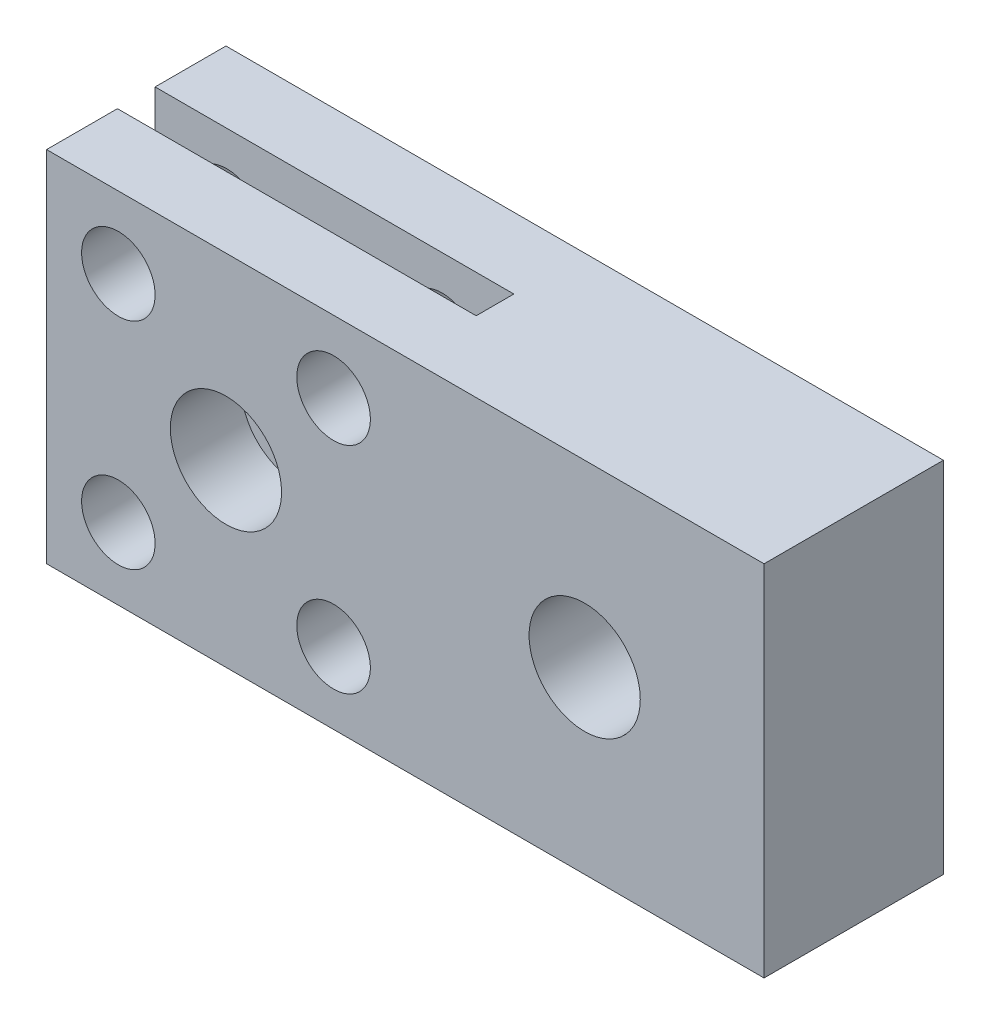
ISO-10303-21;
HEADER;
FILE_DESCRIPTION(('STEP AP214'),'2;1');
FILE_NAME('part.step','',(''),(''),'','','');
FILE_SCHEMA(('AUTOMOTIVE_DESIGN { 1 0 10303 214 1 1 1 1 }'));
ENDSEC;
DATA;
#1=APPLICATION_CONTEXT('core data for automotive mechanical design processes');
#2=APPLICATION_PROTOCOL_DEFINITION('international standard','automotive_design',2000,#1);
#3=PRODUCT_CONTEXT('',#1,'mechanical');
#4=PRODUCT('Part','Part','',(#3));
#5=PRODUCT_RELATED_PRODUCT_CATEGORY('part','',(#4));
#6=PRODUCT_DEFINITION_FORMATION('','',#4);
#7=PRODUCT_DEFINITION_CONTEXT('part definition',#1,'design');
#8=PRODUCT_DEFINITION('design','',#6,#7);
#9=PRODUCT_DEFINITION_SHAPE('','',#8);
#10=(LENGTH_UNIT() NAMED_UNIT(*) SI_UNIT(.MILLI.,.METRE.));
#11=(NAMED_UNIT(*) PLANE_ANGLE_UNIT() SI_UNIT($,.RADIAN.));
#12=(NAMED_UNIT(*) SI_UNIT($,.STERADIAN.) SOLID_ANGLE_UNIT());
#13=UNCERTAINTY_MEASURE_WITH_UNIT(LENGTH_MEASURE(1.E-05),#10,'distance_accuracy_value','');
#14=(GEOMETRIC_REPRESENTATION_CONTEXT(3) GLOBAL_UNCERTAINTY_ASSIGNED_CONTEXT((#13)) GLOBAL_UNIT_ASSIGNED_CONTEXT((#10,
#11,#12)) REPRESENTATION_CONTEXT('',''));
#15=CARTESIAN_POINT('',(0.,0.,0.));
#16=DIRECTION('',(0.,0.,1.));
#17=DIRECTION('',(1.,0.,0.));
#18=AXIS2_PLACEMENT_3D('',#15,#16,#17);
#19=CARTESIAN_POINT('',(-20.,9.99999999999998,10.));
#20=DIRECTION('',(1.,0.,0.));
#21=DIRECTION('',(0.,1.,0.));
#22=AXIS2_PLACEMENT_3D('',#19,#20,#21);
#23=PLANE('',#22);
#24=DIRECTION('',(0.,0.,-1.));
#25=VECTOR('',#24,1.);
#26=CARTESIAN_POINT('',(-20.,-10.,10.));
#27=LINE('',#26,#25);
#28=CARTESIAN_POINT('',(-20.,-10.,3.95));
#29=VERTEX_POINT('',#28);
#30=CARTESIAN_POINT('',(-20.,-10.,0.));
#31=VERTEX_POINT('',#30);
#32=EDGE_CURVE('E163',#29,#31,#27,.T.);
#33=ORIENTED_EDGE('',*,*,#32,.F.);
#34=DIRECTION('',(0.,1.,0.));
#35=VECTOR('',#34,1.);
#36=CARTESIAN_POINT('',(-20.,9.99999999999998,3.95));
#37=LINE('',#36,#35);
#38=CARTESIAN_POINT('',(-20.,10.,3.95));
#39=VERTEX_POINT('',#38);
#40=EDGE_CURVE('E139',#29,#39,#37,.T.);
#41=ORIENTED_EDGE('',*,*,#40,.T.);
#42=DIRECTION('',(0.,0.,-1.));
#43=VECTOR('',#42,1.);
#44=CARTESIAN_POINT('',(-20.,9.99999999999998,10.));
#45=LINE('',#44,#43);
#46=CARTESIAN_POINT('',(-20.,9.99999999999998,0.));
#47=VERTEX_POINT('',#46);
#48=EDGE_CURVE('E80',#39,#47,#45,.T.);
#49=ORIENTED_EDGE('',*,*,#48,.T.);
#50=DIRECTION('',(0.,-1.,0.));
#51=VECTOR('',#50,1.);
#52=CARTESIAN_POINT('',(-20.,9.99999999999998,0.));
#53=LINE('',#52,#51);
#54=EDGE_CURVE('E141',#47,#31,#53,.T.);
#55=ORIENTED_EDGE('',*,*,#54,.T.);
#56=EDGE_LOOP('',(#33,#41,#49,#55));
#57=FACE_BOUND('',#56,.T.);
#58=ADVANCED_FACE('F32',(#57),#23,.F.);
#59=CARTESIAN_POINT('',(-20.,9.99999999999998,10.));
#60=VERTEX_POINT('',#59);
#61=CARTESIAN_POINT('',(-20.,9.99999999999998,6.05));
#62=VERTEX_POINT('',#61);
#63=EDGE_CURVE('E155',#60,#62,#45,.T.);
#64=ORIENTED_EDGE('',*,*,#63,.T.);
#65=DIRECTION('',(0.,-1.,0.));
#66=VECTOR('',#65,1.);
#67=CARTESIAN_POINT('',(-20.,9.99999999999998,6.05));
#68=LINE('',#67,#66);
#69=CARTESIAN_POINT('',(-20.,-10.,6.05));
#70=VERTEX_POINT('',#69);
#71=EDGE_CURVE('E49',#62,#70,#68,.T.);
#72=ORIENTED_EDGE('',*,*,#71,.T.);
#73=CARTESIAN_POINT('',(-20.,-10.,10.));
#74=VERTEX_POINT('',#73);
#75=EDGE_CURVE('E41',#74,#70,#27,.T.);
#76=ORIENTED_EDGE('',*,*,#75,.F.);
#77=DIRECTION('',(0.,-1.,0.));
#78=VECTOR('',#77,1.);
#79=CARTESIAN_POINT('',(-20.,9.99999999999998,10.));
#80=LINE('',#79,#78);
#81=EDGE_CURVE('E142',#60,#74,#80,.T.);
#82=ORIENTED_EDGE('',*,*,#81,.F.);
#83=EDGE_LOOP('',(#64,#72,#76,#82));
#84=FACE_BOUND('',#83,.T.);
#85=ADVANCED_FACE('F34',(#84),#23,.F.);
#86=CARTESIAN_POINT('',(20.,-10.,10.));
#87=DIRECTION('',(0.,1.,0.));
#88=DIRECTION('',(0.,0.,1.));
#89=AXIS2_PLACEMENT_3D('',#86,#87,#88);
#90=PLANE('',#89);
#91=DIRECTION('',(0.,0.,1.));
#92=VECTOR('',#91,1.);
#93=CARTESIAN_POINT('',(0.,-10.,6.05));
#94=LINE('',#93,#92);
#95=CARTESIAN_POINT('',(0.,-10.,3.95));
#96=VERTEX_POINT('',#95);
#97=CARTESIAN_POINT('',(0.,-10.,6.05));
#98=VERTEX_POINT('',#97);
#99=EDGE_CURVE('E117',#96,#98,#94,.T.);
#100=ORIENTED_EDGE('',*,*,#99,.F.);
#101=DIRECTION('',(1.,0.,0.));
#102=VECTOR('',#101,1.);
#103=CARTESIAN_POINT('',(-40.,-10.,3.95));
#104=LINE('',#103,#102);
#105=EDGE_CURVE('E127',#29,#96,#104,.T.);
#106=ORIENTED_EDGE('',*,*,#105,.F.);
#107=ORIENTED_EDGE('',*,*,#32,.T.);
#108=DIRECTION('',(1.,0.,0.));
#109=VECTOR('',#108,1.);
#110=CARTESIAN_POINT('',(20.,-10.,0.));
#111=LINE('',#110,#109);
#112=CARTESIAN_POINT('',(20.,-10.,0.));
#113=VERTEX_POINT('',#112);
#114=EDGE_CURVE('E150',#31,#113,#111,.T.);
#115=ORIENTED_EDGE('',*,*,#114,.T.);
#116=DIRECTION('',(0.,0.,-1.));
#117=VECTOR('',#116,1.);
#118=CARTESIAN_POINT('',(20.,-10.,10.));
#119=LINE('',#118,#117);
#120=CARTESIAN_POINT('',(20.,-10.,10.));
#121=VERTEX_POINT('',#120);
#122=EDGE_CURVE('E160',#121,#113,#119,.T.);
#123=ORIENTED_EDGE('',*,*,#122,.F.);
#124=DIRECTION('',(1.,0.,0.));
#125=VECTOR('',#124,1.);
#126=CARTESIAN_POINT('',(20.,-10.,10.));
#127=LINE('',#126,#125);
#128=EDGE_CURVE('E88',#74,#121,#127,.T.);
#129=ORIENTED_EDGE('',*,*,#128,.F.);
#130=ORIENTED_EDGE('',*,*,#75,.T.);
#131=DIRECTION('',(-1.,0.,0.));
#132=VECTOR('',#131,1.);
#133=CARTESIAN_POINT('',(-40.,-10.,6.05));
#134=LINE('',#133,#132);
#135=EDGE_CURVE('E129',#98,#70,#134,.T.);
#136=ORIENTED_EDGE('',*,*,#135,.F.);
#137=EDGE_LOOP('',(#100,#106,#107,#115,#123,#129,#130,#136));
#138=FACE_BOUND('',#137,.T.);
#139=ADVANCED_FACE('F212',(#138),#90,.F.);
#140=CARTESIAN_POINT('',(20.,10.,10.));
#141=DIRECTION('',(-1.,0.,0.));
#142=DIRECTION('',(0.,-1.,0.));
#143=AXIS2_PLACEMENT_3D('',#140,#141,#142);
#144=PLANE('',#143);
#145=DIRECTION('',(0.,1.,0.));
#146=VECTOR('',#145,1.);
#147=CARTESIAN_POINT('',(20.,10.,0.));
#148=LINE('',#147,#146);
#149=CARTESIAN_POINT('',(20.,10.,0.));
#150=VERTEX_POINT('',#149);
#151=EDGE_CURVE('E152',#113,#150,#148,.T.);
#152=ORIENTED_EDGE('',*,*,#151,.T.);
#153=DIRECTION('',(0.,0.,-1.));
#154=VECTOR('',#153,1.);
#155=CARTESIAN_POINT('',(20.,10.,10.));
#156=LINE('',#155,#154);
#157=CARTESIAN_POINT('',(20.,10.,10.));
#158=VERTEX_POINT('',#157);
#159=EDGE_CURVE('E157',#158,#150,#156,.T.);
#160=ORIENTED_EDGE('',*,*,#159,.F.);
#161=DIRECTION('',(0.,1.,0.));
#162=VECTOR('',#161,1.);
#163=CARTESIAN_POINT('',(20.,10.,10.));
#164=LINE('',#163,#162);
#165=EDGE_CURVE('E146',#121,#158,#164,.T.);
#166=ORIENTED_EDGE('',*,*,#165,.F.);
#167=ORIENTED_EDGE('',*,*,#122,.T.);
#168=EDGE_LOOP('',(#152,#160,#166,#167));
#169=FACE_BOUND('',#168,.T.);
#170=ADVANCED_FACE('F233',(#169),#144,.F.);
#171=CARTESIAN_POINT('',(20.,10.,10.));
#172=DIRECTION('',(0.,-1.,0.));
#173=DIRECTION('',(1.,0.,0.));
#174=AXIS2_PLACEMENT_3D('',#171,#172,#173);
#175=PLANE('',#174);
#176=ORIENTED_EDGE('',*,*,#48,.F.);
#177=DIRECTION('',(1.,0.,0.));
#178=VECTOR('',#177,1.);
#179=CARTESIAN_POINT('',(20.,10.,3.95));
#180=LINE('',#179,#178);
#181=CARTESIAN_POINT('',(0.,10.,3.95));
#182=VERTEX_POINT('',#181);
#183=EDGE_CURVE('E11',#39,#182,#180,.T.);
#184=ORIENTED_EDGE('',*,*,#183,.T.);
#185=DIRECTION('',(0.,0.,1.));
#186=VECTOR('',#185,1.);
#187=CARTESIAN_POINT('',(0.,10.,6.05));
#188=LINE('',#187,#186);
#189=CARTESIAN_POINT('',(0.,10.,6.05));
#190=VERTEX_POINT('',#189);
#191=EDGE_CURVE('E115',#182,#190,#188,.T.);
#192=ORIENTED_EDGE('',*,*,#191,.T.);
#193=DIRECTION('',(-1.,0.,0.));
#194=VECTOR('',#193,1.);
#195=CARTESIAN_POINT('',(-40.,10.,6.05));
#196=LINE('',#195,#194);
#197=EDGE_CURVE('E120',#190,#62,#196,.T.);
#198=ORIENTED_EDGE('',*,*,#197,.T.);
#199=ORIENTED_EDGE('',*,*,#63,.F.);
#200=DIRECTION('',(-1.,0.,0.));
#201=VECTOR('',#200,1.);
#202=CARTESIAN_POINT('',(20.,10.,10.));
#203=LINE('',#202,#201);
#204=EDGE_CURVE('E58',#158,#60,#203,.T.);
#205=ORIENTED_EDGE('',*,*,#204,.F.);
#206=ORIENTED_EDGE('',*,*,#159,.T.);
#207=DIRECTION('',(-1.,0.,0.));
#208=VECTOR('',#207,1.);
#209=CARTESIAN_POINT('',(20.,10.,0.));
#210=LINE('',#209,#208);
#211=EDGE_CURVE('E144',#150,#47,#210,.T.);
#212=ORIENTED_EDGE('',*,*,#211,.T.);
#213=EDGE_LOOP('',(#176,#184,#192,#198,#199,#205,#206,#212));
#214=FACE_BOUND('',#213,.T.);
#215=ADVANCED_FACE('F126',(#214),#175,.F.);
#216=CARTESIAN_POINT('',(0.,0.,10.));
#217=DIRECTION('',(0.,0.,-1.));
#218=DIRECTION('',(-1.,0.,0.));
#219=AXIS2_PLACEMENT_3D('',#216,#217,#218);
#220=PLANE('',#219);
#221=CARTESIAN_POINT('',(10.,0.,10.));
#222=DIRECTION('',(0.,0.,-1.));
#223=DIRECTION('',(1.,0.,0.));
#224=AXIS2_PLACEMENT_3D('',#221,#222,#223);
#225=CIRCLE('',#224,3.1);
#226=CARTESIAN_POINT('',(13.1,0.,10.));
#227=VERTEX_POINT('',#226);
#228=EDGE_CURVE('E397',#227,#227,#225,.T.);
#229=ORIENTED_EDGE('',*,*,#228,.T.);
#230=EDGE_LOOP('',(#229));
#231=FACE_BOUND('',#230,.T.);
#232=CARTESIAN_POINT('',(-10.,0.,10.));
#233=DIRECTION('',(0.,0.,-1.));
#234=DIRECTION('',(-1.,0.,0.));
#235=AXIS2_PLACEMENT_3D('',#232,#233,#234);
#236=CIRCLE('',#235,3.1);
#237=CARTESIAN_POINT('',(-13.1,0.,10.));
#238=VERTEX_POINT('',#237);
#239=EDGE_CURVE('E405',#238,#238,#236,.T.);
#240=ORIENTED_EDGE('',*,*,#239,.T.);
#241=EDGE_LOOP('',(#240));
#242=FACE_BOUND('',#241,.T.);
#243=CARTESIAN_POINT('',(-4.,6.,10.));
#244=DIRECTION('',(0.,0.,-1.));
#245=DIRECTION('',(-1.,0.,0.));
#246=AXIS2_PLACEMENT_3D('',#243,#244,#245);
#247=CIRCLE('',#246,2.05);
#248=CARTESIAN_POINT('',(-6.05,6.,10.));
#249=VERTEX_POINT('',#248);
#250=EDGE_CURVE('E173',#249,#249,#247,.T.);
#251=ORIENTED_EDGE('',*,*,#250,.T.);
#252=EDGE_LOOP('',(#251));
#253=FACE_BOUND('',#252,.T.);
#254=CARTESIAN_POINT('',(-4.,-6.,10.));
#255=DIRECTION('',(0.,0.,-1.));
#256=DIRECTION('',(-1.,0.,0.));
#257=AXIS2_PLACEMENT_3D('',#254,#255,#256);
#258=CIRCLE('',#257,2.05);
#259=CARTESIAN_POINT('',(-6.05,-6.,10.));
#260=VERTEX_POINT('',#259);
#261=EDGE_CURVE('E418',#260,#260,#258,.T.);
#262=ORIENTED_EDGE('',*,*,#261,.T.);
#263=EDGE_LOOP('',(#262));
#264=FACE_BOUND('',#263,.T.);
#265=CARTESIAN_POINT('',(-16.,-6.,10.));
#266=DIRECTION('',(0.,0.,-1.));
#267=DIRECTION('',(-1.,0.,0.));
#268=AXIS2_PLACEMENT_3D('',#265,#266,#267);
#269=CIRCLE('',#268,2.05);
#270=CARTESIAN_POINT('',(-18.05,-6.,10.));
#271=VERTEX_POINT('',#270);
#272=EDGE_CURVE('E424',#271,#271,#269,.T.);
#273=ORIENTED_EDGE('',*,*,#272,.T.);
#274=EDGE_LOOP('',(#273));
#275=FACE_BOUND('',#274,.T.);
#276=CARTESIAN_POINT('',(-16.,6.,10.));
#277=DIRECTION('',(0.,0.,-1.));
#278=DIRECTION('',(-1.,0.,0.));
#279=AXIS2_PLACEMENT_3D('',#276,#277,#278);
#280=CIRCLE('',#279,2.05);
#281=CARTESIAN_POINT('',(-18.05,6.,10.));
#282=VERTEX_POINT('',#281);
#283=EDGE_CURVE('E168',#282,#282,#280,.T.);
#284=ORIENTED_EDGE('',*,*,#283,.T.);
#285=EDGE_LOOP('',(#284));
#286=FACE_BOUND('',#285,.T.);
#287=ORIENTED_EDGE('',*,*,#81,.T.);
#288=ORIENTED_EDGE('',*,*,#128,.T.);
#289=ORIENTED_EDGE('',*,*,#165,.T.);
#290=ORIENTED_EDGE('',*,*,#204,.T.);
#291=EDGE_LOOP('',(#287,#288,#289,#290));
#292=FACE_BOUND('',#291,.T.);
#293=ADVANCED_FACE('F203',(#231,#242,#253,#264,#275,#286,#292),#220,.F.);
#294=CARTESIAN_POINT('',(0.,0.,0.));
#295=DIRECTION('',(0.,0.,-1.));
#296=DIRECTION('',(-1.,0.,0.));
#297=AXIS2_PLACEMENT_3D('',#294,#295,#296);
#298=PLANE('',#297);
#299=CARTESIAN_POINT('',(10.,0.,0.));
#300=DIRECTION('',(0.,0.,-1.));
#301=DIRECTION('',(1.,0.,0.));
#302=AXIS2_PLACEMENT_3D('',#299,#300,#301);
#303=CIRCLE('',#302,3.1);
#304=CARTESIAN_POINT('',(13.1,0.,0.));
#305=VERTEX_POINT('',#304);
#306=EDGE_CURVE('E400',#305,#305,#303,.T.);
#307=ORIENTED_EDGE('',*,*,#306,.F.);
#308=EDGE_LOOP('',(#307));
#309=FACE_BOUND('',#308,.T.);
#310=CARTESIAN_POINT('',(-10.,0.,0.));
#311=DIRECTION('',(0.,0.,-1.));
#312=DIRECTION('',(-1.,0.,0.));
#313=AXIS2_PLACEMENT_3D('',#310,#311,#312);
#314=CIRCLE('',#313,3.1);
#315=CARTESIAN_POINT('',(-13.1,0.,0.));
#316=VERTEX_POINT('',#315);
#317=EDGE_CURVE('E402',#316,#316,#314,.T.);
#318=ORIENTED_EDGE('',*,*,#317,.F.);
#319=EDGE_LOOP('',(#318));
#320=FACE_BOUND('',#319,.T.);
#321=CARTESIAN_POINT('',(-4.,6.,0.));
#322=DIRECTION('',(0.,0.,-1.));
#323=DIRECTION('',(-1.,0.,0.));
#324=AXIS2_PLACEMENT_3D('',#321,#322,#323);
#325=CIRCLE('',#324,2.05);
#326=CARTESIAN_POINT('',(-6.05,6.,0.));
#327=VERTEX_POINT('',#326);
#328=EDGE_CURVE('E415',#327,#327,#325,.T.);
#329=ORIENTED_EDGE('',*,*,#328,.F.);
#330=EDGE_LOOP('',(#329));
#331=FACE_BOUND('',#330,.T.);
#332=CARTESIAN_POINT('',(-4.,-6.,0.));
#333=DIRECTION('',(0.,0.,-1.));
#334=DIRECTION('',(-1.,0.,0.));
#335=AXIS2_PLACEMENT_3D('',#332,#333,#334);
#336=CIRCLE('',#335,2.05);
#337=CARTESIAN_POINT('',(-6.05,-6.,0.));
#338=VERTEX_POINT('',#337);
#339=EDGE_CURVE('E421',#338,#338,#336,.T.);
#340=ORIENTED_EDGE('',*,*,#339,.F.);
#341=EDGE_LOOP('',(#340));
#342=FACE_BOUND('',#341,.T.);
#343=CARTESIAN_POINT('',(-16.,-6.,0.));
#344=DIRECTION('',(0.,0.,-1.));
#345=DIRECTION('',(-1.,0.,0.));
#346=AXIS2_PLACEMENT_3D('',#343,#344,#345);
#347=CIRCLE('',#346,2.05);
#348=CARTESIAN_POINT('',(-18.05,-6.,0.));
#349=VERTEX_POINT('',#348);
#350=EDGE_CURVE('E412',#349,#349,#347,.T.);
#351=ORIENTED_EDGE('',*,*,#350,.F.);
#352=EDGE_LOOP('',(#351));
#353=FACE_BOUND('',#352,.T.);
#354=CARTESIAN_POINT('',(-16.,6.,0.));
#355=DIRECTION('',(0.,0.,-1.));
#356=DIRECTION('',(-1.,0.,0.));
#357=AXIS2_PLACEMENT_3D('',#354,#355,#356);
#358=CIRCLE('',#357,2.05);
#359=CARTESIAN_POINT('',(-18.05,6.,0.));
#360=VERTEX_POINT('',#359);
#361=EDGE_CURVE('E183',#360,#360,#358,.T.);
#362=ORIENTED_EDGE('',*,*,#361,.F.);
#363=EDGE_LOOP('',(#362));
#364=FACE_BOUND('',#363,.T.);
#365=ORIENTED_EDGE('',*,*,#54,.F.);
#366=ORIENTED_EDGE('',*,*,#211,.F.);
#367=ORIENTED_EDGE('',*,*,#151,.F.);
#368=ORIENTED_EDGE('',*,*,#114,.F.);
#369=EDGE_LOOP('',(#365,#366,#367,#368));
#370=FACE_BOUND('',#369,.T.);
#371=ADVANCED_FACE('F199',(#309,#320,#331,#342,#353,#364,#370),#298,.T.);
#372=CARTESIAN_POINT('',(-40.,10.,3.95));
#373=DIRECTION('',(0.,0.,-1.));
#374=DIRECTION('',(-1.,0.,0.));
#375=AXIS2_PLACEMENT_3D('',#372,#373,#374);
#376=PLANE('',#375);
#377=CARTESIAN_POINT('',(-10.,0.,3.95));
#378=DIRECTION('',(0.,0.,-1.));
#379=DIRECTION('',(-1.,0.,0.));
#380=AXIS2_PLACEMENT_3D('',#377,#378,#379);
#381=CIRCLE('',#380,3.1);
#382=CARTESIAN_POINT('',(-13.1,0.,3.95));
#383=VERTEX_POINT('',#382);
#384=EDGE_CURVE('E410',#383,#383,#381,.T.);
#385=ORIENTED_EDGE('',*,*,#384,.T.);
#386=EDGE_LOOP('',(#385));
#387=FACE_BOUND('',#386,.T.);
#388=CARTESIAN_POINT('',(-4.,6.,3.95));
#389=DIRECTION('',(0.,0.,-1.));
#390=DIRECTION('',(-1.,0.,0.));
#391=AXIS2_PLACEMENT_3D('',#388,#389,#390);
#392=CIRCLE('',#391,2.05);
#393=CARTESIAN_POINT('',(-6.05,6.,3.95));
#394=VERTEX_POINT('',#393);
#395=EDGE_CURVE('E179',#394,#394,#392,.T.);
#396=ORIENTED_EDGE('',*,*,#395,.T.);
#397=EDGE_LOOP('',(#396));
#398=FACE_BOUND('',#397,.T.);
#399=CARTESIAN_POINT('',(-4.,-6.,3.95));
#400=DIRECTION('',(0.,0.,-1.));
#401=DIRECTION('',(-1.,0.,0.));
#402=AXIS2_PLACEMENT_3D('',#399,#400,#401);
#403=CIRCLE('',#402,2.05);
#404=CARTESIAN_POINT('',(-6.05,-6.,3.95));
#405=VERTEX_POINT('',#404);
#406=EDGE_CURVE('E176',#405,#405,#403,.T.);
#407=ORIENTED_EDGE('',*,*,#406,.T.);
#408=EDGE_LOOP('',(#407));
#409=FACE_BOUND('',#408,.T.);
#410=CARTESIAN_POINT('',(-16.,-6.,3.95));
#411=DIRECTION('',(0.,0.,-1.));
#412=DIRECTION('',(-1.,0.,0.));
#413=AXIS2_PLACEMENT_3D('',#410,#411,#412);
#414=CIRCLE('',#413,2.05);
#415=CARTESIAN_POINT('',(-18.05,-6.,3.95));
#416=VERTEX_POINT('',#415);
#417=EDGE_CURVE('E172',#416,#416,#414,.T.);
#418=ORIENTED_EDGE('',*,*,#417,.T.);
#419=EDGE_LOOP('',(#418));
#420=FACE_BOUND('',#419,.T.);
#421=CARTESIAN_POINT('',(-16.,6.,3.95));
#422=DIRECTION('',(0.,0.,-1.));
#423=DIRECTION('',(-1.,0.,0.));
#424=AXIS2_PLACEMENT_3D('',#421,#422,#423);
#425=CIRCLE('',#424,2.05);
#426=CARTESIAN_POINT('',(-18.05,6.,3.95));
#427=VERTEX_POINT('',#426);
#428=EDGE_CURVE('E132',#427,#427,#425,.T.);
#429=ORIENTED_EDGE('',*,*,#428,.T.);
#430=EDGE_LOOP('',(#429));
#431=FACE_BOUND('',#430,.T.);
#432=ORIENTED_EDGE('',*,*,#105,.T.);
#433=DIRECTION('',(0.,-1.,0.));
#434=VECTOR('',#433,1.);
#435=CARTESIAN_POINT('',(0.,10.,3.95));
#436=LINE('',#435,#434);
#437=EDGE_CURVE('E119',#182,#96,#436,.T.);
#438=ORIENTED_EDGE('',*,*,#437,.F.);
#439=ORIENTED_EDGE('',*,*,#183,.F.);
#440=ORIENTED_EDGE('',*,*,#40,.F.);
#441=EDGE_LOOP('',(#432,#438,#439,#440));
#442=FACE_BOUND('',#441,.T.);
#443=ADVANCED_FACE('F202',(#387,#398,#409,#420,#431,#442),#376,.F.);
#444=CARTESIAN_POINT('',(-40.,10.,6.05));
#445=DIRECTION('',(0.,0.,1.));
#446=DIRECTION('',(1.,0.,0.));
#447=AXIS2_PLACEMENT_3D('',#444,#445,#446);
#448=PLANE('',#447);
#449=CARTESIAN_POINT('',(-10.,0.,6.05));
#450=DIRECTION('',(0.,0.,1.));
#451=DIRECTION('',(1.,0.,0.));
#452=AXIS2_PLACEMENT_3D('',#449,#450,#451);
#453=CIRCLE('',#452,3.1);
#454=CARTESIAN_POINT('',(-6.9,0.,6.05));
#455=VERTEX_POINT('',#454);
#456=EDGE_CURVE('E36',#455,#455,#453,.T.);
#457=ORIENTED_EDGE('',*,*,#456,.T.);
#458=EDGE_LOOP('',(#457));
#459=FACE_BOUND('',#458,.T.);
#460=CARTESIAN_POINT('',(-4.,6.,6.05));
#461=DIRECTION('',(0.,0.,1.));
#462=DIRECTION('',(1.,0.,0.));
#463=AXIS2_PLACEMENT_3D('',#460,#461,#462);
#464=CIRCLE('',#463,2.05);
#465=CARTESIAN_POINT('',(-1.95,6.,6.05));
#466=VERTEX_POINT('',#465);
#467=EDGE_CURVE('E177',#466,#466,#464,.T.);
#468=ORIENTED_EDGE('',*,*,#467,.T.);
#469=EDGE_LOOP('',(#468));
#470=FACE_BOUND('',#469,.T.);
#471=CARTESIAN_POINT('',(-4.,-6.,6.05));
#472=DIRECTION('',(0.,0.,1.));
#473=DIRECTION('',(1.,0.,0.));
#474=AXIS2_PLACEMENT_3D('',#471,#472,#473);
#475=CIRCLE('',#474,2.05);
#476=CARTESIAN_POINT('',(-1.95,-6.,6.05));
#477=VERTEX_POINT('',#476);
#478=EDGE_CURVE('E174',#477,#477,#475,.T.);
#479=ORIENTED_EDGE('',*,*,#478,.T.);
#480=EDGE_LOOP('',(#479));
#481=FACE_BOUND('',#480,.T.);
#482=CARTESIAN_POINT('',(-16.,-6.,6.05));
#483=DIRECTION('',(0.,0.,1.));
#484=DIRECTION('',(1.,0.,0.));
#485=AXIS2_PLACEMENT_3D('',#482,#483,#484);
#486=CIRCLE('',#485,2.05);
#487=CARTESIAN_POINT('',(-13.95,-6.,6.05));
#488=VERTEX_POINT('',#487);
#489=EDGE_CURVE('E169',#488,#488,#486,.T.);
#490=ORIENTED_EDGE('',*,*,#489,.T.);
#491=EDGE_LOOP('',(#490));
#492=FACE_BOUND('',#491,.T.);
#493=CARTESIAN_POINT('',(-16.,6.,6.05));
#494=DIRECTION('',(0.,0.,1.));
#495=DIRECTION('',(1.,0.,0.));
#496=AXIS2_PLACEMENT_3D('',#493,#494,#495);
#497=CIRCLE('',#496,2.05);
#498=CARTESIAN_POINT('',(-13.95,6.,6.05));
#499=VERTEX_POINT('',#498);
#500=EDGE_CURVE('E165',#499,#499,#497,.T.);
#501=ORIENTED_EDGE('',*,*,#500,.T.);
#502=EDGE_LOOP('',(#501));
#503=FACE_BOUND('',#502,.T.);
#504=ORIENTED_EDGE('',*,*,#197,.F.);
#505=DIRECTION('',(0.,-1.,0.));
#506=VECTOR('',#505,1.);
#507=CARTESIAN_POINT('',(0.,10.,6.05));
#508=LINE('',#507,#506);
#509=EDGE_CURVE('E111',#190,#98,#508,.T.);
#510=ORIENTED_EDGE('',*,*,#509,.T.);
#511=ORIENTED_EDGE('',*,*,#135,.T.);
#512=ORIENTED_EDGE('',*,*,#71,.F.);
#513=EDGE_LOOP('',(#504,#510,#511,#512));
#514=FACE_BOUND('',#513,.T.);
#515=ADVANCED_FACE('F122',(#459,#470,#481,#492,#503,#514),#448,.F.);
#516=CARTESIAN_POINT('',(0.,10.,6.05));
#517=DIRECTION('',(1.,0.,0.));
#518=DIRECTION('',(0.,0.,-1.));
#519=AXIS2_PLACEMENT_3D('',#516,#517,#518);
#520=PLANE('',#519);
#521=ORIENTED_EDGE('',*,*,#99,.T.);
#522=ORIENTED_EDGE('',*,*,#509,.F.);
#523=ORIENTED_EDGE('',*,*,#191,.F.);
#524=ORIENTED_EDGE('',*,*,#437,.T.);
#525=EDGE_LOOP('',(#521,#522,#523,#524));
#526=FACE_BOUND('',#525,.T.);
#527=ADVANCED_FACE('F112',(#526),#520,.F.);
#528=CARTESIAN_POINT('',(-16.,6.,10.));
#529=DIRECTION('',(0.,0.,-1.));
#530=DIRECTION('',(-1.,0.,0.));
#531=AXIS2_PLACEMENT_3D('',#528,#529,#530);
#532=CYLINDRICAL_SURFACE('',#531,2.05);
#533=ORIENTED_EDGE('',*,*,#283,.F.);
#534=EDGE_LOOP('',(#533));
#535=FACE_BOUND('',#534,.T.);
#536=ORIENTED_EDGE('',*,*,#500,.F.);
#537=EDGE_LOOP('',(#536));
#538=FACE_BOUND('',#537,.T.);
#539=ADVANCED_FACE('F271',(#535,#538),#532,.F.);
#540=ORIENTED_EDGE('',*,*,#361,.T.);
#541=EDGE_LOOP('',(#540));
#542=FACE_BOUND('',#541,.T.);
#543=ORIENTED_EDGE('',*,*,#428,.F.);
#544=EDGE_LOOP('',(#543));
#545=FACE_BOUND('',#544,.T.);
#546=ADVANCED_FACE('F196',(#542,#545),#532,.F.);
#547=CARTESIAN_POINT('',(-16.,-6.,10.));
#548=DIRECTION('',(0.,0.,-1.));
#549=DIRECTION('',(-1.,0.,0.));
#550=AXIS2_PLACEMENT_3D('',#547,#548,#549);
#551=CYLINDRICAL_SURFACE('',#550,2.05);
#552=ORIENTED_EDGE('',*,*,#272,.F.);
#553=EDGE_LOOP('',(#552));
#554=FACE_BOUND('',#553,.T.);
#555=ORIENTED_EDGE('',*,*,#489,.F.);
#556=EDGE_LOOP('',(#555));
#557=FACE_BOUND('',#556,.T.);
#558=ADVANCED_FACE('F288',(#554,#557),#551,.F.);
#559=CARTESIAN_POINT('',(-4.,-6.,10.));
#560=DIRECTION('',(0.,0.,-1.));
#561=DIRECTION('',(-1.,0.,0.));
#562=AXIS2_PLACEMENT_3D('',#559,#560,#561);
#563=CYLINDRICAL_SURFACE('',#562,2.05);
#564=ORIENTED_EDGE('',*,*,#261,.F.);
#565=EDGE_LOOP('',(#564));
#566=FACE_BOUND('',#565,.T.);
#567=ORIENTED_EDGE('',*,*,#478,.F.);
#568=EDGE_LOOP('',(#567));
#569=FACE_BOUND('',#568,.T.);
#570=ADVANCED_FACE('F296',(#566,#569),#563,.F.);
#571=CARTESIAN_POINT('',(-4.,6.,10.));
#572=DIRECTION('',(0.,0.,-1.));
#573=DIRECTION('',(-1.,0.,0.));
#574=AXIS2_PLACEMENT_3D('',#571,#572,#573);
#575=CYLINDRICAL_SURFACE('',#574,2.05);
#576=ORIENTED_EDGE('',*,*,#250,.F.);
#577=EDGE_LOOP('',(#576));
#578=FACE_BOUND('',#577,.T.);
#579=ORIENTED_EDGE('',*,*,#467,.F.);
#580=EDGE_LOOP('',(#579));
#581=FACE_BOUND('',#580,.T.);
#582=ADVANCED_FACE('F307',(#578,#581),#575,.F.);
#583=ORIENTED_EDGE('',*,*,#350,.T.);
#584=EDGE_LOOP('',(#583));
#585=FACE_BOUND('',#584,.T.);
#586=ORIENTED_EDGE('',*,*,#417,.F.);
#587=EDGE_LOOP('',(#586));
#588=FACE_BOUND('',#587,.T.);
#589=ADVANCED_FACE('F299',(#585,#588),#551,.F.);
#590=ORIENTED_EDGE('',*,*,#339,.T.);
#591=EDGE_LOOP('',(#590));
#592=FACE_BOUND('',#591,.T.);
#593=ORIENTED_EDGE('',*,*,#406,.F.);
#594=EDGE_LOOP('',(#593));
#595=FACE_BOUND('',#594,.T.);
#596=ADVANCED_FACE('F310',(#592,#595),#563,.F.);
#597=ORIENTED_EDGE('',*,*,#328,.T.);
#598=EDGE_LOOP('',(#597));
#599=FACE_BOUND('',#598,.T.);
#600=ORIENTED_EDGE('',*,*,#395,.F.);
#601=EDGE_LOOP('',(#600));
#602=FACE_BOUND('',#601,.T.);
#603=ADVANCED_FACE('F320',(#599,#602),#575,.F.);
#604=CARTESIAN_POINT('',(-10.,0.,10.));
#605=DIRECTION('',(0.,0.,-1.));
#606=DIRECTION('',(-1.,0.,0.));
#607=AXIS2_PLACEMENT_3D('',#604,#605,#606);
#608=CYLINDRICAL_SURFACE('',#607,3.1);
#609=ORIENTED_EDGE('',*,*,#239,.F.);
#610=EDGE_LOOP('',(#609));
#611=FACE_BOUND('',#610,.T.);
#612=ORIENTED_EDGE('',*,*,#456,.F.);
#613=EDGE_LOOP('',(#612));
#614=FACE_BOUND('',#613,.T.);
#615=ADVANCED_FACE('F343',(#611,#614),#608,.F.);
#616=ORIENTED_EDGE('',*,*,#317,.T.);
#617=EDGE_LOOP('',(#616));
#618=FACE_BOUND('',#617,.T.);
#619=ORIENTED_EDGE('',*,*,#384,.F.);
#620=EDGE_LOOP('',(#619));
#621=FACE_BOUND('',#620,.T.);
#622=ADVANCED_FACE('F372',(#618,#621),#608,.F.);
#623=CARTESIAN_POINT('',(10.,0.,10.));
#624=DIRECTION('',(0.,0.,-1.));
#625=DIRECTION('',(-1.,0.,0.));
#626=AXIS2_PLACEMENT_3D('',#623,#624,#625);
#627=CYLINDRICAL_SURFACE('',#626,3.1);
#628=ORIENTED_EDGE('',*,*,#228,.F.);
#629=EDGE_LOOP('',(#628));
#630=FACE_BOUND('',#629,.T.);
#631=ORIENTED_EDGE('',*,*,#306,.T.);
#632=EDGE_LOOP('',(#631));
#633=FACE_BOUND('',#632,.T.);
#634=ADVANCED_FACE('F382',(#630,#633),#627,.F.);
#635=CLOSED_SHELL('',(#58,#85,#139,#170,#215,#293,#371,#443,#515,#527,#539,#546,#558,#570,#582,
#589,#596,#603,#615,#622,#634));
#636=MANIFOLD_SOLID_BREP('B2',#635);
#637=ADVANCED_BREP_SHAPE_REPRESENTATION('',(#18,#636),#14);
#638=SHAPE_DEFINITION_REPRESENTATION(#9,#637);
ENDSEC;
END-ISO-10303-21;
